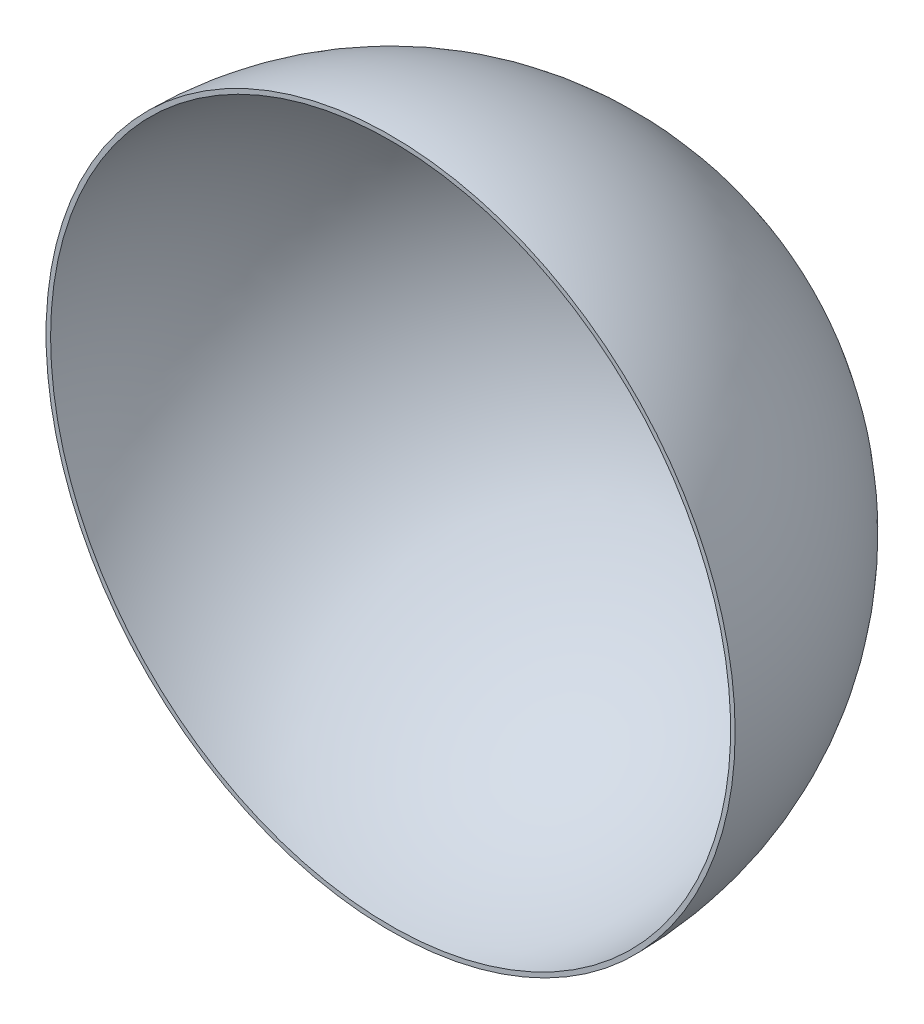
ISO-10303-21;
HEADER;
FILE_DESCRIPTION(('STEP AP214'),'2;1');
FILE_NAME('part.step','',(''),(''),'','','');
FILE_SCHEMA(('AUTOMOTIVE_DESIGN { 1 0 10303 214 1 1 1 1 }'));
ENDSEC;
DATA;
#1=APPLICATION_CONTEXT('core data for automotive mechanical design processes');
#2=APPLICATION_PROTOCOL_DEFINITION('international standard','automotive_design',2000,#1);
#3=PRODUCT_CONTEXT('',#1,'mechanical');
#4=PRODUCT('Part','Part','',(#3));
#5=PRODUCT_RELATED_PRODUCT_CATEGORY('part','',(#4));
#6=PRODUCT_DEFINITION_FORMATION('','',#4);
#7=PRODUCT_DEFINITION_CONTEXT('part definition',#1,'design');
#8=PRODUCT_DEFINITION('design','',#6,#7);
#9=PRODUCT_DEFINITION_SHAPE('','',#8);
#10=(LENGTH_UNIT() NAMED_UNIT(*) SI_UNIT(.MILLI.,.METRE.));
#11=(NAMED_UNIT(*) PLANE_ANGLE_UNIT() SI_UNIT($,.RADIAN.));
#12=(NAMED_UNIT(*) SI_UNIT($,.STERADIAN.) SOLID_ANGLE_UNIT());
#13=UNCERTAINTY_MEASURE_WITH_UNIT(LENGTH_MEASURE(1.E-05),#10,'distance_accuracy_value','');
#14=(GEOMETRIC_REPRESENTATION_CONTEXT(3) GLOBAL_UNCERTAINTY_ASSIGNED_CONTEXT((#13)) GLOBAL_UNIT_ASSIGNED_CONTEXT((#10,
#11,#12)) REPRESENTATION_CONTEXT('',''));
#15=CARTESIAN_POINT('',(0.,0.,0.));
#16=DIRECTION('',(0.,0.,1.));
#17=DIRECTION('',(1.,0.,0.));
#18=AXIS2_PLACEMENT_3D('',#15,#16,#17);
#19=CARTESIAN_POINT('',(0.,0.,0.));
#20=DIRECTION('',(0.,-1.,0.));
#21=DIRECTION('',(-1.,0.,0.));
#22=AXIS2_PLACEMENT_3D('',#19,#20,#21);
#23=SPHERICAL_SURFACE('',#22,375.);
#24=CARTESIAN_POINT('',(0.,0.,0.));
#25=DIRECTION('',(0.,0.,-1.));
#26=DIRECTION('',(-1.,0.,0.));
#27=AXIS2_PLACEMENT_3D('',#24,#25,#26);
#28=SPHERICAL_SURFACE('',#27,375.);
#29=CARTESIAN_POINT('',(0.,0.,0.));
#30=DIRECTION('',(0.,0.,-1.));
#31=DIRECTION('',(-1.,0.,0.));
#32=AXIS2_PLACEMENT_3D('',#29,#30,#31);
#33=CIRCLE('',#32,375.);
#34=CARTESIAN_POINT('',(-375.,-2.61861100413235E-12,2.61861100413235E-12));
#35=VERTEX_POINT('',#34);
#36=EDGE_CURVE('E39',#35,#35,#33,.F.);
#37=ORIENTED_EDGE('',*,*,#36,.T.);
#38=EDGE_LOOP('',(#37));
#39=FACE_BOUND('',#38,.T.);
#40=ADVANCED_FACE('F32',(#39),#28,.F.);
#41=CARTESIAN_POINT('',(0.,0.,0.));
#42=DIRECTION('',(0.,-1.,0.));
#43=DIRECTION('',(-1.,0.,0.));
#44=AXIS2_PLACEMENT_3D('',#41,#42,#43);
#45=SPHERICAL_SURFACE('',#44,380.);
#46=CARTESIAN_POINT('',(0.,0.,0.));
#47=DIRECTION('',(0.,0.,1.));
#48=DIRECTION('',(1.,0.,0.));
#49=AXIS2_PLACEMENT_3D('',#46,#47,#48);
#50=SPHERICAL_SURFACE('',#49,380.);
#51=CARTESIAN_POINT('',(0.,0.,0.));
#52=DIRECTION('',(0.,0.,1.));
#53=DIRECTION('',(1.,0.,0.));
#54=AXIS2_PLACEMENT_3D('',#51,#52,#53);
#55=CIRCLE('',#54,380.);
#56=CARTESIAN_POINT('',(380.,2.65352581752078E-12,-2.65352581752078E-12));
#57=VERTEX_POINT('',#56);
#58=EDGE_CURVE('E10',#57,#57,#55,.T.);
#59=ORIENTED_EDGE('',*,*,#58,.F.);
#60=EDGE_LOOP('',(#59));
#61=FACE_BOUND('',#60,.T.);
#62=ADVANCED_FACE('F34',(#61),#50,.T.);
#63=CARTESIAN_POINT('',(0.,0.,0.));
#64=DIRECTION('',(0.,0.,-1.));
#65=DIRECTION('',(-1.,0.,0.));
#66=AXIS2_PLACEMENT_3D('',#63,#64,#65);
#67=PLANE('',#66);
#68=ORIENTED_EDGE('',*,*,#36,.F.);
#69=EDGE_LOOP('',(#68));
#70=FACE_BOUND('',#69,.T.);
#71=ORIENTED_EDGE('',*,*,#58,.T.);
#72=EDGE_LOOP('',(#71));
#73=FACE_BOUND('',#72,.T.);
#74=ADVANCED_FACE('F46',(#70,#73),#67,.F.);
#75=CLOSED_SHELL('',(#40,#62,#74));
#76=MANIFOLD_SOLID_BREP('B2',#75);
#77=ADVANCED_BREP_SHAPE_REPRESENTATION('',(#18,#76),#14);
#78=SHAPE_DEFINITION_REPRESENTATION(#9,#77);
ENDSEC;
END-ISO-10303-21;
